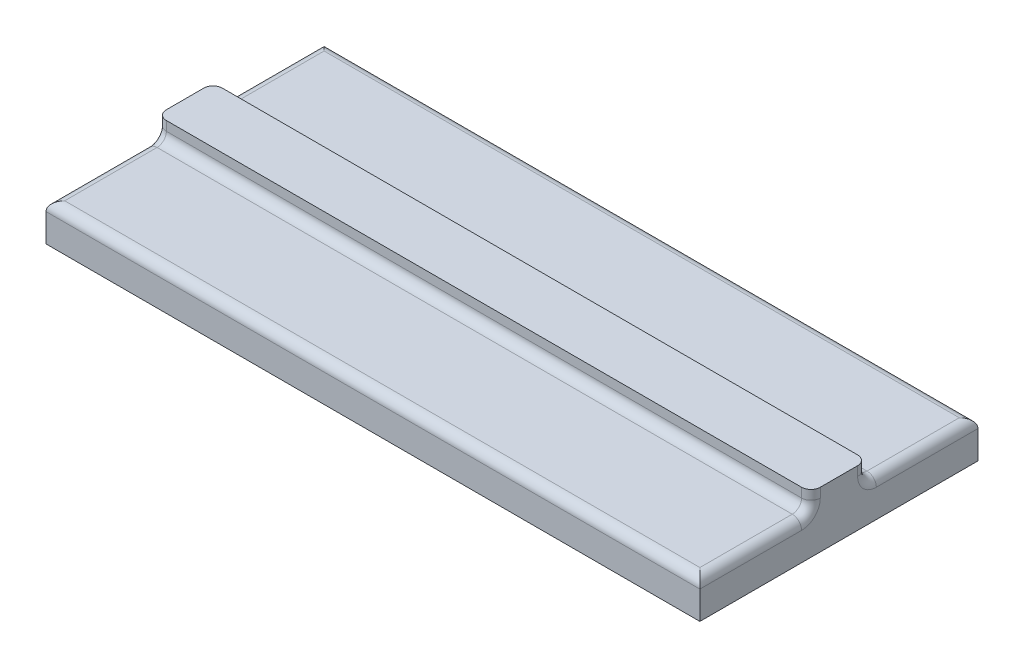
ISO-10303-21;
HEADER;
FILE_DESCRIPTION(('STEP AP214'),'2;1');
FILE_NAME('part.step','',(''),(''),'','','');
FILE_SCHEMA(('AUTOMOTIVE_DESIGN { 1 0 10303 214 1 1 1 1 }'));
ENDSEC;
DATA;
#1=APPLICATION_CONTEXT('core data for automotive mechanical design processes');
#2=APPLICATION_PROTOCOL_DEFINITION('international standard','automotive_design',2000,#1);
#3=PRODUCT_CONTEXT('',#1,'mechanical');
#4=PRODUCT('Part','Part','',(#3));
#5=PRODUCT_RELATED_PRODUCT_CATEGORY('part','',(#4));
#6=PRODUCT_DEFINITION_FORMATION('','',#4);
#7=PRODUCT_DEFINITION_CONTEXT('part definition',#1,'design');
#8=PRODUCT_DEFINITION('design','',#6,#7);
#9=PRODUCT_DEFINITION_SHAPE('','',#8);
#10=(LENGTH_UNIT() NAMED_UNIT(*) SI_UNIT(.MILLI.,.METRE.));
#11=(NAMED_UNIT(*) PLANE_ANGLE_UNIT() SI_UNIT($,.RADIAN.));
#12=(NAMED_UNIT(*) SI_UNIT($,.STERADIAN.) SOLID_ANGLE_UNIT());
#13=UNCERTAINTY_MEASURE_WITH_UNIT(LENGTH_MEASURE(1.E-05),#10,'distance_accuracy_value','');
#14=(GEOMETRIC_REPRESENTATION_CONTEXT(3) GLOBAL_UNCERTAINTY_ASSIGNED_CONTEXT((#13)) GLOBAL_UNIT_ASSIGNED_CONTEXT((#10,
#11,#12)) REPRESENTATION_CONTEXT('',''));
#15=CARTESIAN_POINT('',(0.,0.,0.));
#16=DIRECTION('',(0.,0.,1.));
#17=DIRECTION('',(1.,0.,0.));
#18=AXIS2_PLACEMENT_3D('',#15,#16,#17);
#19=CARTESIAN_POINT('',(175.,0.,-74.4274809160306));
#20=DIRECTION('',(0.,0.,1.));
#21=DIRECTION('',(1.,0.,0.));
#22=AXIS2_PLACEMENT_3D('',#19,#20,#21);
#23=PLANE('',#22);
#24=DIRECTION('',(0.,1.,0.));
#25=VECTOR('',#24,1.);
#26=CARTESIAN_POINT('',(-175.,0.,-74.4274809160306));
#27=LINE('',#26,#25);
#28=CARTESIAN_POINT('',(-175.,0.,-74.4274809160306));
#29=VERTEX_POINT('',#28);
#30=CARTESIAN_POINT('',(-175.,15.,-74.4274809160306));
#31=VERTEX_POINT('',#30);
#32=EDGE_CURVE('E200',#29,#31,#27,.T.);
#33=ORIENTED_EDGE('',*,*,#32,.T.);
#34=DIRECTION('',(-1.,0.,0.));
#35=VECTOR('',#34,1.);
#36=CARTESIAN_POINT('',(175.,15.,-74.4274809160306));
#37=LINE('',#36,#35);
#38=CARTESIAN_POINT('',(175.,15.,-74.4274809160306));
#39=VERTEX_POINT('',#38);
#40=EDGE_CURVE('E306',#31,#39,#37,.F.);
#41=ORIENTED_EDGE('',*,*,#40,.T.);
#42=DIRECTION('',(0.,1.,0.));
#43=VECTOR('',#42,1.);
#44=CARTESIAN_POINT('',(175.,0.,-74.4274809160306));
#45=LINE('',#44,#43);
#46=CARTESIAN_POINT('',(175.,0.,-74.4274809160306));
#47=VERTEX_POINT('',#46);
#48=EDGE_CURVE('E213',#47,#39,#45,.T.);
#49=ORIENTED_EDGE('',*,*,#48,.F.);
#50=DIRECTION('',(-1.,0.,0.));
#51=VECTOR('',#50,1.);
#52=CARTESIAN_POINT('',(175.,0.,-74.4274809160306));
#53=LINE('',#52,#51);
#54=EDGE_CURVE('E189',#47,#29,#53,.T.);
#55=ORIENTED_EDGE('',*,*,#54,.T.);
#56=EDGE_LOOP('',(#33,#41,#49,#55));
#57=FACE_BOUND('',#56,.T.);
#58=ADVANCED_FACE('F40',(#57),#23,.F.);
#59=CARTESIAN_POINT('',(175.,20.,-74.4274809160306));
#60=DIRECTION('',(0.,-1.,0.));
#61=DIRECTION('',(0.,0.,-1.));
#62=AXIS2_PLACEMENT_3D('',#59,#60,#61);
#63=PLANE('',#62);
#64=DIRECTION('',(0.,0.,1.));
#65=VECTOR('',#64,1.);
#66=CARTESIAN_POINT('',(170.,20.,-74.4274809160306));
#67=LINE('',#66,#65);
#68=CARTESIAN_POINT('',(170.,20.,-20.));
#69=VERTEX_POINT('',#68);
#70=CARTESIAN_POINT('',(170.,20.,-69.4274809160306));
#71=VERTEX_POINT('',#70);
#72=EDGE_CURVE('E299',#69,#71,#67,.F.);
#73=ORIENTED_EDGE('',*,*,#72,.T.);
#74=DIRECTION('',(-1.,0.,0.));
#75=VECTOR('',#74,1.);
#76=CARTESIAN_POINT('',(175.,20.,-69.4274809160306));
#77=LINE('',#76,#75);
#78=CARTESIAN_POINT('',(-170.,20.,-69.4274809160306));
#79=VERTEX_POINT('',#78);
#80=EDGE_CURVE('E302',#71,#79,#77,.T.);
#81=ORIENTED_EDGE('',*,*,#80,.T.);
#82=DIRECTION('',(0.,0.,1.));
#83=VECTOR('',#82,1.);
#84=CARTESIAN_POINT('',(-170.,20.,-74.4274809160306));
#85=LINE('',#84,#83);
#86=CARTESIAN_POINT('',(-170.,20.,-20.));
#87=VERTEX_POINT('',#86);
#88=EDGE_CURVE('E293',#79,#87,#85,.T.);
#89=ORIENTED_EDGE('',*,*,#88,.T.);
#90=DIRECTION('',(-1.,0.,0.));
#91=VECTOR('',#90,1.);
#92=CARTESIAN_POINT('',(175.,20.,-20.));
#93=LINE('',#92,#91);
#94=EDGE_CURVE('E296',#87,#69,#93,.F.);
#95=ORIENTED_EDGE('',*,*,#94,.T.);
#96=EDGE_LOOP('',(#73,#81,#89,#95));
#97=FACE_BOUND('',#96,.T.);
#98=ADVANCED_FACE('F427',(#97),#63,.F.);
#99=CARTESIAN_POINT('',(175.,20.,-15.));
#100=DIRECTION('',(0.,0.,1.));
#101=DIRECTION('',(0.,-1.,0.));
#102=AXIS2_PLACEMENT_3D('',#99,#100,#101);
#103=PLANE('',#102);
#104=DIRECTION('',(-1.,0.,0.));
#105=VECTOR('',#104,1.);
#106=CARTESIAN_POINT('',(175.,30.,-15.));
#107=LINE('',#106,#105);
#108=CARTESIAN_POINT('',(170.,30.,-15.));
#109=VERTEX_POINT('',#108);
#110=CARTESIAN_POINT('',(-170.,30.,-15.));
#111=VERTEX_POINT('',#110);
#112=EDGE_CURVE('E218',#109,#111,#107,.T.);
#113=ORIENTED_EDGE('',*,*,#112,.F.);
#114=DIRECTION('',(0.,1.,0.));
#115=VECTOR('',#114,1.);
#116=CARTESIAN_POINT('',(170.,20.,-15.));
#117=LINE('',#116,#115);
#118=CARTESIAN_POINT('',(170.,25.,-15.));
#119=VERTEX_POINT('',#118);
#120=EDGE_CURVE('E261',#109,#119,#117,.F.);
#121=ORIENTED_EDGE('',*,*,#120,.T.);
#122=DIRECTION('',(-1.,0.,0.));
#123=VECTOR('',#122,1.);
#124=CARTESIAN_POINT('',(-175.,25.,-15.));
#125=LINE('',#124,#123);
#126=CARTESIAN_POINT('',(-170.,25.,-15.));
#127=VERTEX_POINT('',#126);
#128=EDGE_CURVE('E255',#119,#127,#125,.T.);
#129=ORIENTED_EDGE('',*,*,#128,.T.);
#130=DIRECTION('',(0.,1.,0.));
#131=VECTOR('',#130,1.);
#132=CARTESIAN_POINT('',(-170.,20.,-15.));
#133=LINE('',#132,#131);
#134=EDGE_CURVE('E258',#127,#111,#133,.T.);
#135=ORIENTED_EDGE('',*,*,#134,.T.);
#136=EDGE_LOOP('',(#113,#121,#129,#135));
#137=FACE_BOUND('',#136,.T.);
#138=ADVANCED_FACE('F433',(#137),#103,.F.);
#139=CARTESIAN_POINT('',(175.,30.,15.));
#140=DIRECTION('',(0.,-1.,0.));
#141=DIRECTION('',(0.,0.,-1.));
#142=AXIS2_PLACEMENT_3D('',#139,#140,#141);
#143=PLANE('',#142);
#144=DIRECTION('',(0.,0.,1.));
#145=VECTOR('',#144,1.);
#146=CARTESIAN_POINT('',(175.,30.,15.));
#147=LINE('',#146,#145);
#148=CARTESIAN_POINT('',(175.,30.,-9.99999999999999));
#149=VERTEX_POINT('',#148);
#150=CARTESIAN_POINT('',(175.,30.,10.));
#151=VERTEX_POINT('',#150);
#152=EDGE_CURVE('E178',#149,#151,#147,.T.);
#153=ORIENTED_EDGE('',*,*,#152,.F.);
#154=CARTESIAN_POINT('',(170.,30.,-9.99999999999998));
#155=DIRECTION('',(0.,-1.,0.));
#156=DIRECTION('',(0.,0.,-1.));
#157=AXIS2_PLACEMENT_3D('',#154,#155,#156);
#158=CIRCLE('',#157,5.);
#159=EDGE_CURVE('E252',#149,#109,#158,.F.);
#160=ORIENTED_EDGE('',*,*,#159,.T.);
#161=ORIENTED_EDGE('',*,*,#112,.T.);
#162=CARTESIAN_POINT('',(-170.,30.,-9.99999999999998));
#163=DIRECTION('',(0.,-1.,0.));
#164=DIRECTION('',(0.,0.,-1.));
#165=AXIS2_PLACEMENT_3D('',#162,#163,#164);
#166=CIRCLE('',#165,5.);
#167=CARTESIAN_POINT('',(-175.,30.,-9.99999999999999));
#168=VERTEX_POINT('',#167);
#169=EDGE_CURVE('E249',#111,#168,#166,.F.);
#170=ORIENTED_EDGE('',*,*,#169,.T.);
#171=DIRECTION('',(0.,0.,1.));
#172=VECTOR('',#171,1.);
#173=CARTESIAN_POINT('',(-175.,30.,15.));
#174=LINE('',#173,#172);
#175=CARTESIAN_POINT('',(-175.,30.,10.));
#176=VERTEX_POINT('',#175);
#177=EDGE_CURVE('E204',#168,#176,#174,.T.);
#178=ORIENTED_EDGE('',*,*,#177,.T.);
#179=CARTESIAN_POINT('',(-170.,30.,10.));
#180=DIRECTION('',(0.,-1.,0.));
#181=DIRECTION('',(0.,0.,-1.));
#182=AXIS2_PLACEMENT_3D('',#179,#180,#181);
#183=CIRCLE('',#182,5.);
#184=CARTESIAN_POINT('',(-170.,30.,15.));
#185=VERTEX_POINT('',#184);
#186=EDGE_CURVE('E243',#176,#185,#183,.F.);
#187=ORIENTED_EDGE('',*,*,#186,.T.);
#188=DIRECTION('',(-1.,0.,0.));
#189=VECTOR('',#188,1.);
#190=CARTESIAN_POINT('',(175.,30.,15.));
#191=LINE('',#190,#189);
#192=CARTESIAN_POINT('',(170.,30.,15.));
#193=VERTEX_POINT('',#192);
#194=EDGE_CURVE('E188',#193,#185,#191,.T.);
#195=ORIENTED_EDGE('',*,*,#194,.F.);
#196=CARTESIAN_POINT('',(170.,30.,10.));
#197=DIRECTION('',(0.,-1.,0.));
#198=DIRECTION('',(0.,0.,-1.));
#199=AXIS2_PLACEMENT_3D('',#196,#197,#198);
#200=CIRCLE('',#199,5.);
#201=EDGE_CURVE('E246',#193,#151,#200,.F.);
#202=ORIENTED_EDGE('',*,*,#201,.T.);
#203=EDGE_LOOP('',(#153,#160,#161,#170,#178,#187,#195,#202));
#204=FACE_BOUND('',#203,.T.);
#205=ADVANCED_FACE('F423',(#204),#143,.F.);
#206=CARTESIAN_POINT('',(175.,20.,15.));
#207=DIRECTION('',(0.,0.,-1.));
#208=DIRECTION('',(-1.,0.,0.));
#209=AXIS2_PLACEMENT_3D('',#206,#207,#208);
#210=PLANE('',#209);
#211=DIRECTION('',(-1.,0.,0.));
#212=VECTOR('',#211,1.);
#213=CARTESIAN_POINT('',(175.,25.,15.));
#214=LINE('',#213,#212);
#215=CARTESIAN_POINT('',(-170.,25.,15.));
#216=VERTEX_POINT('',#215);
#217=CARTESIAN_POINT('',(170.,25.,15.));
#218=VERTEX_POINT('',#217);
#219=EDGE_CURVE('E284',#216,#218,#214,.F.);
#220=ORIENTED_EDGE('',*,*,#219,.T.);
#221=DIRECTION('',(0.,-1.,0.));
#222=VECTOR('',#221,1.);
#223=CARTESIAN_POINT('',(170.,30.,15.));
#224=LINE('',#223,#222);
#225=EDGE_CURVE('E290',#218,#193,#224,.F.);
#226=ORIENTED_EDGE('',*,*,#225,.T.);
#227=ORIENTED_EDGE('',*,*,#194,.T.);
#228=DIRECTION('',(0.,-1.,0.));
#229=VECTOR('',#228,1.);
#230=CARTESIAN_POINT('',(-170.,20.,15.));
#231=LINE('',#230,#229);
#232=EDGE_CURVE('E287',#185,#216,#231,.T.);
#233=ORIENTED_EDGE('',*,*,#232,.T.);
#234=EDGE_LOOP('',(#220,#226,#227,#233));
#235=FACE_BOUND('',#234,.T.);
#236=ADVANCED_FACE('F416',(#235),#210,.F.);
#237=CARTESIAN_POINT('',(175.,20.,74.4274809160306));
#238=DIRECTION('',(0.,-1.,0.));
#239=DIRECTION('',(0.,0.,-1.));
#240=AXIS2_PLACEMENT_3D('',#237,#238,#239);
#241=PLANE('',#240);
#242=DIRECTION('',(0.,0.,1.));
#243=VECTOR('',#242,1.);
#244=CARTESIAN_POINT('',(170.,20.,15.));
#245=LINE('',#244,#243);
#246=CARTESIAN_POINT('',(170.,20.,69.4274809160306));
#247=VERTEX_POINT('',#246);
#248=CARTESIAN_POINT('',(170.,20.,20.));
#249=VERTEX_POINT('',#248);
#250=EDGE_CURVE('E58',#247,#249,#245,.F.);
#251=ORIENTED_EDGE('',*,*,#250,.T.);
#252=DIRECTION('',(-1.,0.,0.));
#253=VECTOR('',#252,1.);
#254=CARTESIAN_POINT('',(-175.,20.,20.));
#255=LINE('',#254,#253);
#256=CARTESIAN_POINT('',(-170.,20.,20.));
#257=VERTEX_POINT('',#256);
#258=EDGE_CURVE('E50',#249,#257,#255,.T.);
#259=ORIENTED_EDGE('',*,*,#258,.T.);
#260=DIRECTION('',(0.,0.,1.));
#261=VECTOR('',#260,1.);
#262=CARTESIAN_POINT('',(-170.,20.,74.4274809160306));
#263=LINE('',#262,#261);
#264=CARTESIAN_POINT('',(-170.,20.,69.4274809160306));
#265=VERTEX_POINT('',#264);
#266=EDGE_CURVE('E309',#257,#265,#263,.T.);
#267=ORIENTED_EDGE('',*,*,#266,.T.);
#268=DIRECTION('',(-1.,0.,0.));
#269=VECTOR('',#268,1.);
#270=CARTESIAN_POINT('',(175.,20.,69.4274809160306));
#271=LINE('',#270,#269);
#272=EDGE_CURVE('E63',#265,#247,#271,.F.);
#273=ORIENTED_EDGE('',*,*,#272,.T.);
#274=EDGE_LOOP('',(#251,#259,#267,#273));
#275=FACE_BOUND('',#274,.T.);
#276=ADVANCED_FACE('F414',(#275),#241,.F.);
#277=CARTESIAN_POINT('',(175.,0.,74.4274809160306));
#278=DIRECTION('',(0.,0.,-1.));
#279=DIRECTION('',(-1.,0.,0.));
#280=AXIS2_PLACEMENT_3D('',#277,#278,#279);
#281=PLANE('',#280);
#282=DIRECTION('',(0.,-1.,0.));
#283=VECTOR('',#282,1.);
#284=CARTESIAN_POINT('',(175.,0.,74.4274809160306));
#285=LINE('',#284,#283);
#286=CARTESIAN_POINT('',(175.,15.,74.4274809160306));
#287=VERTEX_POINT('',#286);
#288=CARTESIAN_POINT('',(175.,0.,74.4274809160306));
#289=VERTEX_POINT('',#288);
#290=EDGE_CURVE('E166',#287,#289,#285,.T.);
#291=ORIENTED_EDGE('',*,*,#290,.F.);
#292=DIRECTION('',(-1.,0.,0.));
#293=VECTOR('',#292,1.);
#294=CARTESIAN_POINT('',(175.,15.,74.4274809160306));
#295=LINE('',#294,#293);
#296=CARTESIAN_POINT('',(-175.,15.,74.4274809160306));
#297=VERTEX_POINT('',#296);
#298=EDGE_CURVE('E11',#287,#297,#295,.T.);
#299=ORIENTED_EDGE('',*,*,#298,.T.);
#300=DIRECTION('',(0.,-1.,0.));
#301=VECTOR('',#300,1.);
#302=CARTESIAN_POINT('',(-175.,0.,74.4274809160306));
#303=LINE('',#302,#301);
#304=CARTESIAN_POINT('',(-175.,0.,74.4274809160306));
#305=VERTEX_POINT('',#304);
#306=EDGE_CURVE('E184',#297,#305,#303,.T.);
#307=ORIENTED_EDGE('',*,*,#306,.T.);
#308=DIRECTION('',(-1.,0.,0.));
#309=VECTOR('',#308,1.);
#310=CARTESIAN_POINT('',(175.,0.,74.4274809160306));
#311=LINE('',#310,#309);
#312=EDGE_CURVE('E181',#289,#305,#311,.T.);
#313=ORIENTED_EDGE('',*,*,#312,.F.);
#314=EDGE_LOOP('',(#291,#299,#307,#313));
#315=FACE_BOUND('',#314,.T.);
#316=ADVANCED_FACE('F182',(#315),#281,.F.);
#317=CARTESIAN_POINT('',(175.,0.,-74.4274809160306));
#318=DIRECTION('',(0.,1.,0.));
#319=DIRECTION('',(0.,0.,1.));
#320=AXIS2_PLACEMENT_3D('',#317,#318,#319);
#321=PLANE('',#320);
#322=DIRECTION('',(0.,0.,-1.));
#323=VECTOR('',#322,1.);
#324=CARTESIAN_POINT('',(-175.,0.,-74.4274809160306));
#325=LINE('',#324,#323);
#326=EDGE_CURVE('E211',#305,#29,#325,.T.);
#327=ORIENTED_EDGE('',*,*,#326,.T.);
#328=ORIENTED_EDGE('',*,*,#54,.F.);
#329=DIRECTION('',(0.,0.,-1.));
#330=VECTOR('',#329,1.);
#331=CARTESIAN_POINT('',(175.,0.,-74.4274809160306));
#332=LINE('',#331,#330);
#333=EDGE_CURVE('E171',#289,#47,#332,.T.);
#334=ORIENTED_EDGE('',*,*,#333,.F.);
#335=ORIENTED_EDGE('',*,*,#312,.T.);
#336=EDGE_LOOP('',(#327,#328,#334,#335));
#337=FACE_BOUND('',#336,.T.);
#338=ADVANCED_FACE('F191',(#337),#321,.F.);
#339=CARTESIAN_POINT('',(175.,0.,0.));
#340=DIRECTION('',(1.,0.,0.));
#341=DIRECTION('',(0.,0.,-1.));
#342=AXIS2_PLACEMENT_3D('',#339,#340,#341);
#343=PLANE('',#342);
#344=CARTESIAN_POINT('',(175.,25.,-20.));
#345=DIRECTION('',(1.,0.,0.));
#346=DIRECTION('',(0.,0.,-1.));
#347=AXIS2_PLACEMENT_3D('',#344,#345,#346);
#348=CIRCLE('',#347,10.);
#349=CARTESIAN_POINT('',(175.,25.,-10.));
#350=VERTEX_POINT('',#349);
#351=CARTESIAN_POINT('',(175.,15.,-20.));
#352=VERTEX_POINT('',#351);
#353=EDGE_CURVE('E232',#350,#352,#348,.T.);
#354=ORIENTED_EDGE('',*,*,#353,.F.);
#355=DIRECTION('',(0.,1.,0.));
#356=VECTOR('',#355,1.);
#357=CARTESIAN_POINT('',(175.,30.,-9.99999999999998));
#358=LINE('',#357,#356);
#359=EDGE_CURVE('E239',#350,#149,#358,.T.);
#360=ORIENTED_EDGE('',*,*,#359,.T.);
#361=ORIENTED_EDGE('',*,*,#152,.T.);
#362=DIRECTION('',(0.,-1.,0.));
#363=VECTOR('',#362,1.);
#364=CARTESIAN_POINT('',(175.,20.,10.));
#365=LINE('',#364,#363);
#366=CARTESIAN_POINT('',(175.,25.,10.));
#367=VERTEX_POINT('',#366);
#368=EDGE_CURVE('E228',#151,#367,#365,.T.);
#369=ORIENTED_EDGE('',*,*,#368,.T.);
#370=CARTESIAN_POINT('',(175.,25.,20.));
#371=DIRECTION('',(1.,0.,0.));
#372=DIRECTION('',(0.,0.,-1.));
#373=AXIS2_PLACEMENT_3D('',#370,#371,#372);
#374=CIRCLE('',#373,10.);
#375=CARTESIAN_POINT('',(175.,15.,20.));
#376=VERTEX_POINT('',#375);
#377=EDGE_CURVE('E224',#376,#367,#374,.T.);
#378=ORIENTED_EDGE('',*,*,#377,.F.);
#379=DIRECTION('',(0.,0.,1.));
#380=VECTOR('',#379,1.);
#381=CARTESIAN_POINT('',(175.,15.,74.4274809160306));
#382=LINE('',#381,#380);
#383=EDGE_CURVE('E174',#376,#287,#382,.T.);
#384=ORIENTED_EDGE('',*,*,#383,.T.);
#385=ORIENTED_EDGE('',*,*,#290,.T.);
#386=ORIENTED_EDGE('',*,*,#333,.T.);
#387=ORIENTED_EDGE('',*,*,#48,.T.);
#388=DIRECTION('',(0.,0.,1.));
#389=VECTOR('',#388,1.);
#390=CARTESIAN_POINT('',(175.,15.,-15.));
#391=LINE('',#390,#389);
#392=EDGE_CURVE('E236',#39,#352,#391,.T.);
#393=ORIENTED_EDGE('',*,*,#392,.T.);
#394=EDGE_LOOP('',(#354,#360,#361,#369,#378,#384,#385,#386,#387,#393));
#395=FACE_BOUND('',#394,.T.);
#396=ADVANCED_FACE('F168',(#395),#343,.T.);
#397=CARTESIAN_POINT('',(-175.,0.,0.));
#398=DIRECTION('',(1.,0.,0.));
#399=DIRECTION('',(0.,0.,-1.));
#400=AXIS2_PLACEMENT_3D('',#397,#398,#399);
#401=PLANE('',#400);
#402=ORIENTED_EDGE('',*,*,#177,.F.);
#403=DIRECTION('',(0.,1.,0.));
#404=VECTOR('',#403,1.);
#405=CARTESIAN_POINT('',(-175.,0.,-10.0000000000001));
#406=LINE('',#405,#404);
#407=CARTESIAN_POINT('',(-175.,25.,-10.));
#408=VERTEX_POINT('',#407);
#409=EDGE_CURVE('E281',#168,#408,#406,.F.);
#410=ORIENTED_EDGE('',*,*,#409,.T.);
#411=CARTESIAN_POINT('',(-175.,25.,-20.));
#412=DIRECTION('',(1.,0.,0.));
#413=DIRECTION('',(0.,0.,-1.));
#414=AXIS2_PLACEMENT_3D('',#411,#412,#413);
#415=CIRCLE('',#414,10.);
#416=CARTESIAN_POINT('',(-175.,15.,-20.));
#417=VERTEX_POINT('',#416);
#418=EDGE_CURVE('E277',#417,#408,#415,.F.);
#419=ORIENTED_EDGE('',*,*,#418,.F.);
#420=DIRECTION('',(0.,0.,1.));
#421=VECTOR('',#420,1.);
#422=CARTESIAN_POINT('',(-175.,15.,0.));
#423=LINE('',#422,#421);
#424=EDGE_CURVE('E274',#417,#31,#423,.F.);
#425=ORIENTED_EDGE('',*,*,#424,.T.);
#426=ORIENTED_EDGE('',*,*,#32,.F.);
#427=ORIENTED_EDGE('',*,*,#326,.F.);
#428=ORIENTED_EDGE('',*,*,#306,.F.);
#429=DIRECTION('',(0.,0.,1.));
#430=VECTOR('',#429,1.);
#431=CARTESIAN_POINT('',(-175.,15.,0.));
#432=LINE('',#431,#430);
#433=CARTESIAN_POINT('',(-175.,15.,20.));
#434=VERTEX_POINT('',#433);
#435=EDGE_CURVE('E268',#297,#434,#432,.F.);
#436=ORIENTED_EDGE('',*,*,#435,.T.);
#437=CARTESIAN_POINT('',(-175.,25.,20.));
#438=DIRECTION('',(1.,0.,0.));
#439=DIRECTION('',(0.,0.,-1.));
#440=AXIS2_PLACEMENT_3D('',#437,#438,#439);
#441=CIRCLE('',#440,10.);
#442=CARTESIAN_POINT('',(-175.,25.,10.));
#443=VERTEX_POINT('',#442);
#444=EDGE_CURVE('E264',#443,#434,#441,.F.);
#445=ORIENTED_EDGE('',*,*,#444,.F.);
#446=DIRECTION('',(0.,-1.,0.));
#447=VECTOR('',#446,1.);
#448=CARTESIAN_POINT('',(-175.,0.,10.));
#449=LINE('',#448,#447);
#450=EDGE_CURVE('E271',#443,#176,#449,.F.);
#451=ORIENTED_EDGE('',*,*,#450,.T.);
#452=EDGE_LOOP('',(#402,#410,#419,#425,#426,#427,#428,#436,#445,#451));
#453=FACE_BOUND('',#452,.T.);
#454=ADVANCED_FACE('F385',(#453),#401,.F.);
#455=CARTESIAN_POINT('',(-170.,20.,-10.));
#456=DIRECTION('',(0.,1.,0.));
#457=DIRECTION('',(0.,0.,1.));
#458=AXIS2_PLACEMENT_3D('',#455,#456,#457);
#459=CYLINDRICAL_SURFACE('',#458,5.);
#460=ORIENTED_EDGE('',*,*,#169,.F.);
#461=ORIENTED_EDGE('',*,*,#134,.F.);
#462=CARTESIAN_POINT('',(-170.,25.,-10.));
#463=DIRECTION('',(0.,-1.,0.));
#464=DIRECTION('',(0.,0.,-1.));
#465=AXIS2_PLACEMENT_3D('',#462,#463,#464);
#466=CIRCLE('',#465,5.);
#467=EDGE_CURVE('E205',#408,#127,#466,.T.);
#468=ORIENTED_EDGE('',*,*,#467,.F.);
#469=ORIENTED_EDGE('',*,*,#409,.F.);
#470=EDGE_LOOP('',(#460,#461,#468,#469));
#471=FACE_BOUND('',#470,.T.);
#472=ADVANCED_FACE('F465',(#471),#459,.T.);
#473=CARTESIAN_POINT('',(-170.,15.,-74.4274809160306));
#474=DIRECTION('',(0.,0.,1.));
#475=DIRECTION('',(0.,-1.,0.));
#476=AXIS2_PLACEMENT_3D('',#473,#474,#475);
#477=CYLINDRICAL_SURFACE('',#476,5.);
#478=CARTESIAN_POINT('',(-170.,15.,-69.4274809160306));
#479=DIRECTION('',(-0.707106781186547,0.,0.707106781186547));
#480=DIRECTION('',(0.707106781186547,0.,0.707106781186547));
#481=AXIS2_PLACEMENT_3D('',#478,#479,#480);
#482=ELLIPSE('',#481,7.07106781186547,5.);
#483=EDGE_CURVE('E338',#31,#79,#482,.F.);
#484=ORIENTED_EDGE('',*,*,#483,.F.);
#485=ORIENTED_EDGE('',*,*,#424,.F.);
#486=CARTESIAN_POINT('',(-170.,15.,-20.));
#487=DIRECTION('',(0.,0.,1.));
#488=DIRECTION('',(1.,0.,0.));
#489=AXIS2_PLACEMENT_3D('',#486,#487,#488);
#490=CIRCLE('',#489,5.);
#491=EDGE_CURVE('E341',#87,#417,#490,.T.);
#492=ORIENTED_EDGE('',*,*,#491,.F.);
#493=ORIENTED_EDGE('',*,*,#88,.F.);
#494=EDGE_LOOP('',(#484,#485,#492,#493));
#495=FACE_BOUND('',#494,.T.);
#496=ADVANCED_FACE('F461',(#495),#477,.T.);
#497=CARTESIAN_POINT('',(-170.,25.,-20.));
#498=DIRECTION('',(1.,0.,0.));
#499=DIRECTION('',(0.,0.,-1.));
#500=AXIS2_PLACEMENT_3D('',#497,#498,#499);
#501=TOROIDAL_SURFACE('',#500,10.,5.);
#502=ORIENTED_EDGE('',*,*,#418,.T.);
#503=ORIENTED_EDGE('',*,*,#467,.T.);
#504=CARTESIAN_POINT('',(-170.,25.,-20.));
#505=DIRECTION('',(1.,0.,0.));
#506=DIRECTION('',(0.,0.,-1.));
#507=AXIS2_PLACEMENT_3D('',#504,#505,#506);
#508=CIRCLE('',#507,5.);
#509=EDGE_CURVE('E334',#87,#127,#508,.F.);
#510=ORIENTED_EDGE('',*,*,#509,.F.);
#511=ORIENTED_EDGE('',*,*,#491,.T.);
#512=EDGE_LOOP('',(#502,#503,#510,#511));
#513=FACE_BOUND('',#512,.T.);
#514=ADVANCED_FACE('F457',(#513),#501,.T.);
#515=CARTESIAN_POINT('',(175.,15.,-69.4274809160306));
#516=DIRECTION('',(-1.,0.,0.));
#517=DIRECTION('',(0.,0.,1.));
#518=AXIS2_PLACEMENT_3D('',#515,#516,#517);
#519=CYLINDRICAL_SURFACE('',#518,5.);
#520=ORIENTED_EDGE('',*,*,#483,.T.);
#521=ORIENTED_EDGE('',*,*,#80,.F.);
#522=CARTESIAN_POINT('',(170.,15.,-69.4274809160306));
#523=DIRECTION('',(-0.707106781186547,0.,-0.707106781186547));
#524=DIRECTION('',(0.707106781186547,0.,-0.707106781186547));
#525=AXIS2_PLACEMENT_3D('',#522,#523,#524);
#526=ELLIPSE('',#525,7.07106781186547,5.);
#527=EDGE_CURVE('E330',#39,#71,#526,.F.);
#528=ORIENTED_EDGE('',*,*,#527,.F.);
#529=ORIENTED_EDGE('',*,*,#40,.F.);
#530=EDGE_LOOP('',(#520,#521,#528,#529));
#531=FACE_BOUND('',#530,.T.);
#532=ADVANCED_FACE('F453',(#531),#519,.T.);
#533=CARTESIAN_POINT('',(175.,25.,-20.));
#534=DIRECTION('',(1.,0.,0.));
#535=DIRECTION('',(0.,0.,-1.));
#536=AXIS2_PLACEMENT_3D('',#533,#534,#535);
#537=CYLINDRICAL_SURFACE('',#536,5.);
#538=ORIENTED_EDGE('',*,*,#509,.T.);
#539=ORIENTED_EDGE('',*,*,#128,.F.);
#540=CARTESIAN_POINT('',(170.,25.,-20.));
#541=DIRECTION('',(1.,0.,0.));
#542=DIRECTION('',(0.,0.,-1.));
#543=AXIS2_PLACEMENT_3D('',#540,#541,#542);
#544=CIRCLE('',#543,5.);
#545=EDGE_CURVE('E326',#69,#119,#544,.F.);
#546=ORIENTED_EDGE('',*,*,#545,.F.);
#547=ORIENTED_EDGE('',*,*,#94,.F.);
#548=EDGE_LOOP('',(#538,#539,#546,#547));
#549=FACE_BOUND('',#548,.T.);
#550=ADVANCED_FACE('F449',(#549),#537,.F.);
#551=CARTESIAN_POINT('',(170.,15.,0.));
#552=DIRECTION('',(0.,0.,-1.));
#553=DIRECTION('',(0.,1.,0.));
#554=AXIS2_PLACEMENT_3D('',#551,#552,#553);
#555=CYLINDRICAL_SURFACE('',#554,5.);
#556=ORIENTED_EDGE('',*,*,#527,.T.);
#557=ORIENTED_EDGE('',*,*,#72,.F.);
#558=CARTESIAN_POINT('',(170.,15.,-20.));
#559=DIRECTION('',(0.,0.,1.));
#560=DIRECTION('',(1.,0.,0.));
#561=AXIS2_PLACEMENT_3D('',#558,#559,#560);
#562=CIRCLE('',#561,5.);
#563=EDGE_CURVE('E322',#352,#69,#562,.T.);
#564=ORIENTED_EDGE('',*,*,#563,.F.);
#565=ORIENTED_EDGE('',*,*,#392,.F.);
#566=EDGE_LOOP('',(#556,#557,#564,#565));
#567=FACE_BOUND('',#566,.T.);
#568=ADVANCED_FACE('F445',(#567),#555,.T.);
#569=CARTESIAN_POINT('',(170.,25.,-20.));
#570=DIRECTION('',(1.,0.,0.));
#571=DIRECTION('',(0.,0.,-1.));
#572=AXIS2_PLACEMENT_3D('',#569,#570,#571);
#573=TOROIDAL_SURFACE('',#572,10.,5.);
#574=ORIENTED_EDGE('',*,*,#563,.T.);
#575=ORIENTED_EDGE('',*,*,#545,.T.);
#576=CARTESIAN_POINT('',(170.,25.,-10.));
#577=DIRECTION('',(0.,-1.,0.));
#578=DIRECTION('',(0.,0.,-1.));
#579=AXIS2_PLACEMENT_3D('',#576,#577,#578);
#580=CIRCLE('',#579,5.);
#581=EDGE_CURVE('E318',#350,#119,#580,.F.);
#582=ORIENTED_EDGE('',*,*,#581,.F.);
#583=ORIENTED_EDGE('',*,*,#353,.T.);
#584=EDGE_LOOP('',(#574,#575,#582,#583));
#585=FACE_BOUND('',#584,.T.);
#586=ADVANCED_FACE('F441',(#585),#573,.T.);
#587=CARTESIAN_POINT('',(170.,0.,-10.0000000000001));
#588=DIRECTION('',(0.,-1.,0.));
#589=DIRECTION('',(0.,0.,-1.));
#590=AXIS2_PLACEMENT_3D('',#587,#588,#589);
#591=CYLINDRICAL_SURFACE('',#590,5.);
#592=ORIENTED_EDGE('',*,*,#581,.T.);
#593=ORIENTED_EDGE('',*,*,#120,.F.);
#594=ORIENTED_EDGE('',*,*,#159,.F.);
#595=ORIENTED_EDGE('',*,*,#359,.F.);
#596=EDGE_LOOP('',(#592,#593,#594,#595));
#597=FACE_BOUND('',#596,.T.);
#598=ADVANCED_FACE('F438',(#597),#591,.T.);
#599=CARTESIAN_POINT('',(-170.,15.,74.4274809160306));
#600=DIRECTION('',(0.,0.,1.));
#601=DIRECTION('',(0.,-1.,0.));
#602=AXIS2_PLACEMENT_3D('',#599,#600,#601);
#603=CYLINDRICAL_SURFACE('',#602,5.);
#604=CARTESIAN_POINT('',(-170.,15.,20.));
#605=DIRECTION('',(0.,0.,-1.));
#606=DIRECTION('',(-1.,0.,0.));
#607=AXIS2_PLACEMENT_3D('',#604,#605,#606);
#608=CIRCLE('',#607,5.);
#609=EDGE_CURVE('E369',#434,#257,#608,.T.);
#610=ORIENTED_EDGE('',*,*,#609,.F.);
#611=ORIENTED_EDGE('',*,*,#435,.F.);
#612=CARTESIAN_POINT('',(-170.,15.,69.4274809160306));
#613=DIRECTION('',(0.707106781186547,0.,0.707106781186547));
#614=DIRECTION('',(-0.707106781186547,0.,0.707106781186547));
#615=AXIS2_PLACEMENT_3D('',#612,#613,#614);
#616=ELLIPSE('',#615,7.07106781186547,5.);
#617=EDGE_CURVE('E44',#265,#297,#616,.T.);
#618=ORIENTED_EDGE('',*,*,#617,.F.);
#619=ORIENTED_EDGE('',*,*,#266,.F.);
#620=EDGE_LOOP('',(#610,#611,#618,#619));
#621=FACE_BOUND('',#620,.T.);
#622=ADVANCED_FACE('F42',(#621),#603,.T.);
#623=CARTESIAN_POINT('',(-170.,20.,10.));
#624=DIRECTION('',(0.,-1.,0.));
#625=DIRECTION('',(0.,0.,-1.));
#626=AXIS2_PLACEMENT_3D('',#623,#624,#625);
#627=CYLINDRICAL_SURFACE('',#626,5.);
#628=ORIENTED_EDGE('',*,*,#186,.F.);
#629=ORIENTED_EDGE('',*,*,#450,.F.);
#630=CARTESIAN_POINT('',(-170.,25.,10.));
#631=DIRECTION('',(0.,-1.,0.));
#632=DIRECTION('',(0.,0.,-1.));
#633=AXIS2_PLACEMENT_3D('',#630,#631,#632);
#634=CIRCLE('',#633,5.);
#635=EDGE_CURVE('E366',#216,#443,#634,.T.);
#636=ORIENTED_EDGE('',*,*,#635,.F.);
#637=ORIENTED_EDGE('',*,*,#232,.F.);
#638=EDGE_LOOP('',(#628,#629,#636,#637));
#639=FACE_BOUND('',#638,.T.);
#640=ADVANCED_FACE('F482',(#639),#627,.T.);
#641=CARTESIAN_POINT('',(175.,15.,69.4274809160306));
#642=DIRECTION('',(-1.,0.,0.));
#643=DIRECTION('',(0.,0.,1.));
#644=AXIS2_PLACEMENT_3D('',#641,#642,#643);
#645=CYLINDRICAL_SURFACE('',#644,5.);
#646=ORIENTED_EDGE('',*,*,#617,.T.);
#647=ORIENTED_EDGE('',*,*,#298,.F.);
#648=CARTESIAN_POINT('',(170.,15.,69.4274809160306));
#649=DIRECTION('',(-0.707106781186547,0.,0.707106781186547));
#650=DIRECTION('',(-0.707106781186547,0.,-0.707106781186547));
#651=AXIS2_PLACEMENT_3D('',#648,#649,#650);
#652=ELLIPSE('',#651,7.07106781186547,5.);
#653=EDGE_CURVE('E362',#247,#287,#652,.F.);
#654=ORIENTED_EDGE('',*,*,#653,.F.);
#655=ORIENTED_EDGE('',*,*,#272,.F.);
#656=EDGE_LOOP('',(#646,#647,#654,#655));
#657=FACE_BOUND('',#656,.T.);
#658=ADVANCED_FACE('F380',(#657),#645,.T.);
#659=CARTESIAN_POINT('',(-170.,25.,20.));
#660=DIRECTION('',(1.,0.,0.));
#661=DIRECTION('',(0.,0.,-1.));
#662=AXIS2_PLACEMENT_3D('',#659,#660,#661);
#663=TOROIDAL_SURFACE('',#662,10.,5.);
#664=ORIENTED_EDGE('',*,*,#444,.T.);
#665=ORIENTED_EDGE('',*,*,#609,.T.);
#666=CARTESIAN_POINT('',(-170.,25.,20.));
#667=DIRECTION('',(1.,0.,0.));
#668=DIRECTION('',(0.,0.,-1.));
#669=AXIS2_PLACEMENT_3D('',#666,#667,#668);
#670=CIRCLE('',#669,5.);
#671=EDGE_CURVE('E359',#216,#257,#670,.F.);
#672=ORIENTED_EDGE('',*,*,#671,.F.);
#673=ORIENTED_EDGE('',*,*,#635,.T.);
#674=EDGE_LOOP('',(#664,#665,#672,#673));
#675=FACE_BOUND('',#674,.T.);
#676=ADVANCED_FACE('F478',(#675),#663,.T.);
#677=CARTESIAN_POINT('',(170.,15.,0.));
#678=DIRECTION('',(0.,0.,-1.));
#679=DIRECTION('',(0.,1.,0.));
#680=AXIS2_PLACEMENT_3D('',#677,#678,#679);
#681=CYLINDRICAL_SURFACE('',#680,5.);
#682=ORIENTED_EDGE('',*,*,#653,.T.);
#683=ORIENTED_EDGE('',*,*,#383,.F.);
#684=CARTESIAN_POINT('',(170.,15.,20.));
#685=DIRECTION('',(0.,0.,-1.));
#686=DIRECTION('',(-1.,0.,0.));
#687=AXIS2_PLACEMENT_3D('',#684,#685,#686);
#688=CIRCLE('',#687,5.);
#689=EDGE_CURVE('E355',#249,#376,#688,.T.);
#690=ORIENTED_EDGE('',*,*,#689,.F.);
#691=ORIENTED_EDGE('',*,*,#250,.F.);
#692=EDGE_LOOP('',(#682,#683,#690,#691));
#693=FACE_BOUND('',#692,.T.);
#694=ADVANCED_FACE('F409',(#693),#681,.T.);
#695=CARTESIAN_POINT('',(175.,25.,20.));
#696=DIRECTION('',(1.,0.,0.));
#697=DIRECTION('',(0.,0.,-1.));
#698=AXIS2_PLACEMENT_3D('',#695,#696,#697);
#699=CYLINDRICAL_SURFACE('',#698,5.);
#700=ORIENTED_EDGE('',*,*,#671,.T.);
#701=ORIENTED_EDGE('',*,*,#258,.F.);
#702=CARTESIAN_POINT('',(170.,25.,20.));
#703=DIRECTION('',(1.,0.,0.));
#704=DIRECTION('',(0.,0.,-1.));
#705=AXIS2_PLACEMENT_3D('',#702,#703,#704);
#706=CIRCLE('',#705,5.);
#707=EDGE_CURVE('E351',#218,#249,#706,.F.);
#708=ORIENTED_EDGE('',*,*,#707,.F.);
#709=ORIENTED_EDGE('',*,*,#219,.F.);
#710=EDGE_LOOP('',(#700,#701,#708,#709));
#711=FACE_BOUND('',#710,.T.);
#712=ADVANCED_FACE('F413',(#711),#699,.F.);
#713=CARTESIAN_POINT('',(170.,25.,20.));
#714=DIRECTION('',(1.,0.,0.));
#715=DIRECTION('',(0.,0.,-1.));
#716=AXIS2_PLACEMENT_3D('',#713,#714,#715);
#717=TOROIDAL_SURFACE('',#716,10.,5.);
#718=ORIENTED_EDGE('',*,*,#689,.T.);
#719=ORIENTED_EDGE('',*,*,#377,.T.);
#720=CARTESIAN_POINT('',(170.,25.,10.));
#721=DIRECTION('',(0.,-1.,0.));
#722=DIRECTION('',(0.,0.,-1.));
#723=AXIS2_PLACEMENT_3D('',#720,#721,#722);
#724=CIRCLE('',#723,5.);
#725=EDGE_CURVE('E348',#218,#367,#724,.F.);
#726=ORIENTED_EDGE('',*,*,#725,.F.);
#727=ORIENTED_EDGE('',*,*,#707,.T.);
#728=EDGE_LOOP('',(#718,#719,#726,#727));
#729=FACE_BOUND('',#728,.T.);
#730=ADVANCED_FACE('F406',(#729),#717,.T.);
#731=CARTESIAN_POINT('',(170.,0.,10.));
#732=DIRECTION('',(0.,1.,0.));
#733=DIRECTION('',(0.,0.,1.));
#734=AXIS2_PLACEMENT_3D('',#731,#732,#733);
#735=CYLINDRICAL_SURFACE('',#734,5.);
#736=ORIENTED_EDGE('',*,*,#201,.F.);
#737=ORIENTED_EDGE('',*,*,#225,.F.);
#738=ORIENTED_EDGE('',*,*,#725,.T.);
#739=ORIENTED_EDGE('',*,*,#368,.F.);
#740=EDGE_LOOP('',(#736,#737,#738,#739));
#741=FACE_BOUND('',#740,.T.);
#742=ADVANCED_FACE('F402',(#741),#735,.T.);
#743=CLOSED_SHELL('',(#58,#98,#138,#205,#236,#276,#316,#338,#396,#454,#472,#496,#514,#532,#550,
#568,#586,#598,#622,#640,#658,#676,#694,#712,#730,#742));
#744=MANIFOLD_SOLID_BREP('B2',#743);
#745=ADVANCED_BREP_SHAPE_REPRESENTATION('',(#18,#744),#14);
#746=SHAPE_DEFINITION_REPRESENTATION(#9,#745);
ENDSEC;
END-ISO-10303-21;
